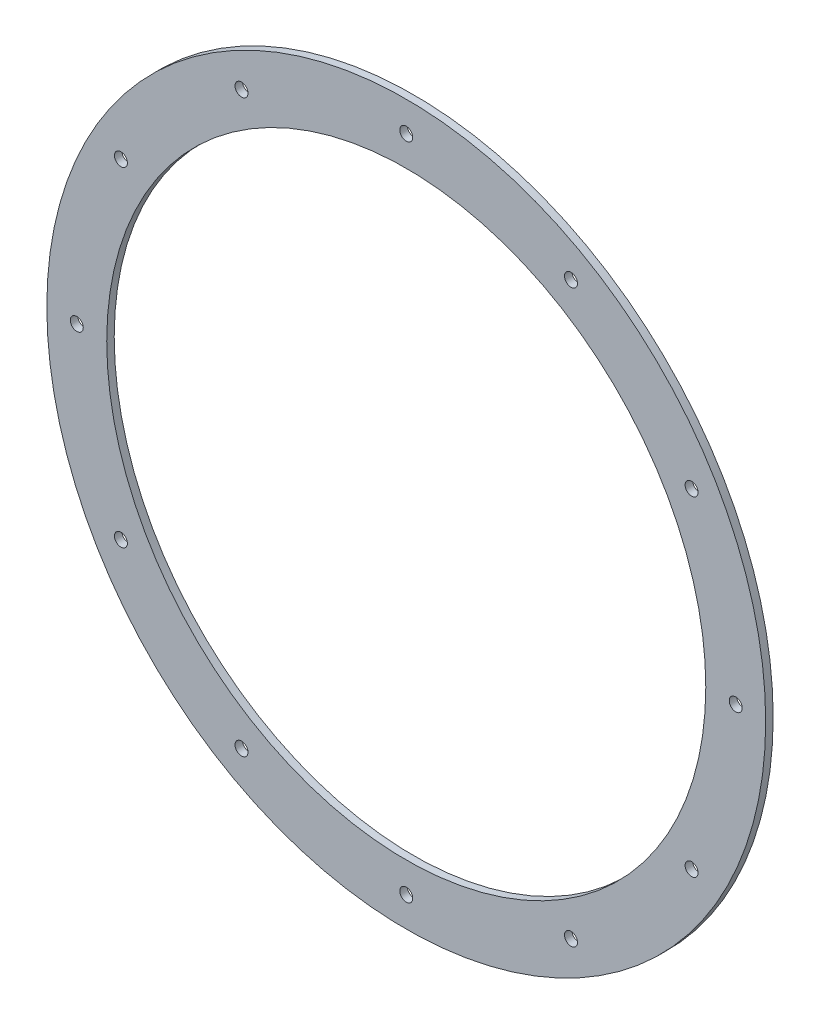
ISO-10303-21;
HEADER;
FILE_DESCRIPTION(('STEP AP214'),'2;1');
FILE_NAME('part.step','',(''),(''),'','','');
FILE_SCHEMA(('AUTOMOTIVE_DESIGN { 1 0 10303 214 1 1 1 1 }'));
ENDSEC;
DATA;
#1=APPLICATION_CONTEXT('core data for automotive mechanical design processes');
#2=APPLICATION_PROTOCOL_DEFINITION('international standard','automotive_design',2000,#1);
#3=PRODUCT_CONTEXT('',#1,'mechanical');
#4=PRODUCT('Part','Part','',(#3));
#5=PRODUCT_RELATED_PRODUCT_CATEGORY('part','',(#4));
#6=PRODUCT_DEFINITION_FORMATION('','',#4);
#7=PRODUCT_DEFINITION_CONTEXT('part definition',#1,'design');
#8=PRODUCT_DEFINITION('design','',#6,#7);
#9=PRODUCT_DEFINITION_SHAPE('','',#8);
#10=(LENGTH_UNIT() NAMED_UNIT(*) SI_UNIT(.MILLI.,.METRE.));
#11=(NAMED_UNIT(*) PLANE_ANGLE_UNIT() SI_UNIT($,.RADIAN.));
#12=(NAMED_UNIT(*) SI_UNIT($,.STERADIAN.) SOLID_ANGLE_UNIT());
#13=UNCERTAINTY_MEASURE_WITH_UNIT(LENGTH_MEASURE(1.E-05),#10,'distance_accuracy_value','');
#14=(GEOMETRIC_REPRESENTATION_CONTEXT(3) GLOBAL_UNCERTAINTY_ASSIGNED_CONTEXT((#13)) GLOBAL_UNIT_ASSIGNED_CONTEXT((#10,
#11,#12)) REPRESENTATION_CONTEXT('',''));
#15=CARTESIAN_POINT('',(0.,0.,0.));
#16=DIRECTION('',(0.,0.,1.));
#17=DIRECTION('',(1.,0.,0.));
#18=AXIS2_PLACEMENT_3D('',#15,#16,#17);
#19=CARTESIAN_POINT('',(0.,0.,12.7));
#20=DIRECTION('',(0.,0.,1.));
#21=DIRECTION('',(1.,0.,0.));
#22=AXIS2_PLACEMENT_3D('',#19,#20,#21);
#23=PLANE('',#22);
#24=CARTESIAN_POINT('',(0.,558.8,12.7));
#25=DIRECTION('',(0.,0.,1.));
#26=DIRECTION('',(1.,0.,0.));
#27=AXIS2_PLACEMENT_3D('',#24,#25,#26);
#28=CIRCLE('',#27,11.);
#29=CARTESIAN_POINT('',(11.,558.8,12.7));
#30=VERTEX_POINT('',#29);
#31=EDGE_CURVE('E49',#30,#30,#28,.T.);
#32=ORIENTED_EDGE('',*,*,#31,.F.);
#33=EDGE_LOOP('',(#32));
#34=FACE_BOUND('',#33,.T.);
#35=CARTESIAN_POINT('',(279.400000000001,483.934995634744,12.7));
#36=DIRECTION('',(0.,0.,1.));
#37=DIRECTION('',(1.,0.,0.));
#38=AXIS2_PLACEMENT_3D('',#35,#36,#37);
#39=CIRCLE('',#38,11.);
#40=CARTESIAN_POINT('',(290.400000000001,483.934995634744,12.7));
#41=VERTEX_POINT('',#40);
#42=EDGE_CURVE('E90',#41,#41,#39,.T.);
#43=ORIENTED_EDGE('',*,*,#42,.F.);
#44=EDGE_LOOP('',(#43));
#45=FACE_BOUND('',#44,.T.);
#46=CARTESIAN_POINT('',(483.934995634756,279.400000000021,12.7));
#47=DIRECTION('',(0.,0.,1.));
#48=DIRECTION('',(1.,0.,0.));
#49=AXIS2_PLACEMENT_3D('',#46,#47,#48);
#50=CIRCLE('',#49,11.0000000000066);
#51=CARTESIAN_POINT('',(494.934995634763,279.400000000021,12.7));
#52=VERTEX_POINT('',#51);
#53=EDGE_CURVE('E84',#52,#52,#50,.T.);
#54=ORIENTED_EDGE('',*,*,#53,.F.);
#55=EDGE_LOOP('',(#54));
#56=FACE_BOUND('',#55,.T.);
#57=CARTESIAN_POINT('',(558.800000000024,2.37546435814283E-11,12.7));
#58=DIRECTION('',(0.,0.,1.));
#59=DIRECTION('',(1.,0.,0.));
#60=AXIS2_PLACEMENT_3D('',#57,#58,#59);
#61=CIRCLE('',#60,11.0000000000176);
#62=CARTESIAN_POINT('',(569.800000000041,2.37546435814283E-11,12.7));
#63=VERTEX_POINT('',#62);
#64=EDGE_CURVE('E78',#63,#63,#61,.T.);
#65=ORIENTED_EDGE('',*,*,#64,.F.);
#66=EDGE_LOOP('',(#65));
#67=FACE_BOUND('',#66,.T.);
#68=CARTESIAN_POINT('',(483.93499563478,-279.399999999979,12.7));
#69=DIRECTION('',(0.,0.,1.));
#70=DIRECTION('',(1.,0.,0.));
#71=AXIS2_PLACEMENT_3D('',#68,#69,#70);
#72=CIRCLE('',#71,11.0000000000306);
#73=CARTESIAN_POINT('',(494.934995634811,-279.399999999979,12.7));
#74=VERTEX_POINT('',#73);
#75=EDGE_CURVE('E72',#74,#74,#72,.T.);
#76=ORIENTED_EDGE('',*,*,#75,.F.);
#77=EDGE_LOOP('',(#76));
#78=FACE_BOUND('',#77,.T.);
#79=CARTESIAN_POINT('',(279.400000000044,-483.934995634732,12.7));
#80=DIRECTION('',(0.,0.,1.));
#81=DIRECTION('',(1.,0.,0.));
#82=AXIS2_PLACEMENT_3D('',#79,#80,#81);
#83=CIRCLE('',#82,11.0000000000423);
#84=CARTESIAN_POINT('',(290.400000000087,-483.934995634732,12.7));
#85=VERTEX_POINT('',#84);
#86=EDGE_CURVE('E66',#85,#85,#83,.T.);
#87=ORIENTED_EDGE('',*,*,#86,.F.);
#88=EDGE_LOOP('',(#87));
#89=FACE_BOUND('',#88,.T.);
#90=CARTESIAN_POINT('',(4.75092871628566E-11,-558.8,12.7));
#91=DIRECTION('',(0.,0.,1.));
#92=DIRECTION('',(1.,0.,0.));
#93=AXIS2_PLACEMENT_3D('',#90,#91,#92);
#94=CIRCLE('',#93,11.0000000000492);
#95=CARTESIAN_POINT('',(11.0000000000967,-558.8,12.7));
#96=VERTEX_POINT('',#95);
#97=EDGE_CURVE('E60',#96,#96,#94,.T.);
#98=ORIENTED_EDGE('',*,*,#97,.F.);
#99=EDGE_LOOP('',(#98));
#100=FACE_BOUND('',#99,.T.);
#101=CARTESIAN_POINT('',(-279.399999999956,-483.934995634756,12.7));
#102=DIRECTION('',(0.,0.,1.));
#103=DIRECTION('',(1.,0.,0.));
#104=AXIS2_PLACEMENT_3D('',#101,#102,#103);
#105=CIRCLE('',#104,11.0000000000504);
#106=CARTESIAN_POINT('',(-268.399999999905,-483.934995634756,12.7));
#107=VERTEX_POINT('',#106);
#108=EDGE_CURVE('E52',#107,#107,#105,.T.);
#109=ORIENTED_EDGE('',*,*,#108,.F.);
#110=EDGE_LOOP('',(#109));
#111=FACE_BOUND('',#110,.T.);
#112=CARTESIAN_POINT('',(-483.934995634709,-279.400000000021,12.7));
#113=DIRECTION('',(0.,0.,1.));
#114=DIRECTION('',(1.,0.,0.));
#115=AXIS2_PLACEMENT_3D('',#112,#113,#114);
#116=CIRCLE('',#115,11.0000000000452);
#117=CARTESIAN_POINT('',(-472.934995634663,-279.400000000021,12.7));
#118=VERTEX_POINT('',#117);
#119=EDGE_CURVE('E59',#118,#118,#116,.T.);
#120=ORIENTED_EDGE('',*,*,#119,.F.);
#121=EDGE_LOOP('',(#120));
#122=FACE_BOUND('',#121,.T.);
#123=CARTESIAN_POINT('',(-558.799999999976,-2.38230768445646E-11,12.7));
#124=DIRECTION('',(0.,0.,1.));
#125=DIRECTION('',(1.,0.,0.));
#126=AXIS2_PLACEMENT_3D('',#123,#124,#125);
#127=CIRCLE('',#126,11.0000000000354);
#128=CARTESIAN_POINT('',(-547.799999999941,-2.38230768445646E-11,12.7));
#129=VERTEX_POINT('',#128);
#130=EDGE_CURVE('E113',#129,#129,#127,.T.);
#131=ORIENTED_EDGE('',*,*,#130,.F.);
#132=EDGE_LOOP('',(#131));
#133=FACE_BOUND('',#132,.T.);
#134=CARTESIAN_POINT('',(-483.934995634733,279.399999999979,12.7));
#135=DIRECTION('',(0.,0.,1.));
#136=DIRECTION('',(1.,0.,0.));
#137=AXIS2_PLACEMENT_3D('',#134,#135,#136);
#138=CIRCLE('',#137,11.000000000024);
#139=CARTESIAN_POINT('',(-472.934995634709,279.399999999979,12.7));
#140=VERTEX_POINT('',#139);
#141=EDGE_CURVE('E107',#140,#140,#138,.T.);
#142=ORIENTED_EDGE('',*,*,#141,.F.);
#143=EDGE_LOOP('',(#142));
#144=FACE_BOUND('',#143,.T.);
#145=CARTESIAN_POINT('',(-279.399999999997,483.934995634732,12.7));
#146=DIRECTION('',(0.,0.,1.));
#147=DIRECTION('',(1.,0.,0.));
#148=AXIS2_PLACEMENT_3D('',#145,#146,#147);
#149=CIRCLE('',#148,11.0000000000136);
#150=CARTESIAN_POINT('',(-268.399999999983,483.934995634732,12.7));
#151=VERTEX_POINT('',#150);
#152=EDGE_CURVE('E100',#151,#151,#149,.T.);
#153=ORIENTED_EDGE('',*,*,#152,.F.);
#154=EDGE_LOOP('',(#153));
#155=FACE_BOUND('',#154,.T.);
#156=CARTESIAN_POINT('',(0.,0.,12.7));
#157=DIRECTION('',(0.,0.,1.));
#158=DIRECTION('',(1.,0.,0.));
#159=AXIS2_PLACEMENT_3D('',#156,#157,#158);
#160=CIRCLE('',#159,609.6);
#161=CARTESIAN_POINT('',(609.6,0.,12.7));
#162=VERTEX_POINT('',#161);
#163=EDGE_CURVE('E10',#162,#162,#160,.T.);
#164=ORIENTED_EDGE('',*,*,#163,.T.);
#165=EDGE_LOOP('',(#164));
#166=FACE_BOUND('',#165,.T.);
#167=CARTESIAN_POINT('',(0.,0.,12.7));
#168=DIRECTION('',(0.,0.,1.));
#169=DIRECTION('',(1.,0.,0.));
#170=AXIS2_PLACEMENT_3D('',#167,#168,#169);
#171=CIRCLE('',#170,508.);
#172=CARTESIAN_POINT('',(508.,0.,12.7));
#173=VERTEX_POINT('',#172);
#174=EDGE_CURVE('E44',#173,#173,#171,.T.);
#175=ORIENTED_EDGE('',*,*,#174,.F.);
#176=EDGE_LOOP('',(#175));
#177=FACE_BOUND('',#176,.T.);
#178=ADVANCED_FACE('F33',(#34,#45,#56,#67,#78,#89,#100,#111,#122,#133,#144,#155,#166,#177),#23,.T.);
#179=CARTESIAN_POINT('',(0.,0.,0.));
#180=DIRECTION('',(0.,0.,1.));
#181=DIRECTION('',(1.,0.,0.));
#182=AXIS2_PLACEMENT_3D('',#179,#180,#181);
#183=PLANE('',#182);
#184=CARTESIAN_POINT('',(0.,558.8,0.));
#185=DIRECTION('',(0.,0.,1.));
#186=DIRECTION('',(1.,0.,0.));
#187=AXIS2_PLACEMENT_3D('',#184,#185,#186);
#188=CIRCLE('',#187,11.);
#189=CARTESIAN_POINT('',(11.,558.8,0.));
#190=VERTEX_POINT('',#189);
#191=EDGE_CURVE('E93',#190,#190,#188,.T.);
#192=ORIENTED_EDGE('',*,*,#191,.T.);
#193=EDGE_LOOP('',(#192));
#194=FACE_BOUND('',#193,.T.);
#195=CARTESIAN_POINT('',(279.400000000001,483.934995634744,0.));
#196=DIRECTION('',(0.,0.,1.));
#197=DIRECTION('',(1.,0.,0.));
#198=AXIS2_PLACEMENT_3D('',#195,#196,#197);
#199=CIRCLE('',#198,11.);
#200=CARTESIAN_POINT('',(290.400000000001,483.934995634744,0.));
#201=VERTEX_POINT('',#200);
#202=EDGE_CURVE('E87',#201,#201,#199,.T.);
#203=ORIENTED_EDGE('',*,*,#202,.T.);
#204=EDGE_LOOP('',(#203));
#205=FACE_BOUND('',#204,.T.);
#206=CARTESIAN_POINT('',(483.934995634756,279.400000000021,0.));
#207=DIRECTION('',(0.,0.,1.));
#208=DIRECTION('',(1.,0.,0.));
#209=AXIS2_PLACEMENT_3D('',#206,#207,#208);
#210=CIRCLE('',#209,11.0000000000066);
#211=CARTESIAN_POINT('',(494.934995634763,279.400000000021,0.));
#212=VERTEX_POINT('',#211);
#213=EDGE_CURVE('E81',#212,#212,#210,.T.);
#214=ORIENTED_EDGE('',*,*,#213,.T.);
#215=EDGE_LOOP('',(#214));
#216=FACE_BOUND('',#215,.T.);
#217=CARTESIAN_POINT('',(558.800000000024,2.37546435814283E-11,0.));
#218=DIRECTION('',(0.,0.,1.));
#219=DIRECTION('',(1.,0.,0.));
#220=AXIS2_PLACEMENT_3D('',#217,#218,#219);
#221=CIRCLE('',#220,11.0000000000176);
#222=CARTESIAN_POINT('',(569.800000000041,2.37546435814283E-11,0.));
#223=VERTEX_POINT('',#222);
#224=EDGE_CURVE('E75',#223,#223,#221,.T.);
#225=ORIENTED_EDGE('',*,*,#224,.T.);
#226=EDGE_LOOP('',(#225));
#227=FACE_BOUND('',#226,.T.);
#228=CARTESIAN_POINT('',(483.93499563478,-279.399999999979,0.));
#229=DIRECTION('',(0.,0.,1.));
#230=DIRECTION('',(1.,0.,0.));
#231=AXIS2_PLACEMENT_3D('',#228,#229,#230);
#232=CIRCLE('',#231,11.0000000000306);
#233=CARTESIAN_POINT('',(494.934995634811,-279.399999999979,0.));
#234=VERTEX_POINT('',#233);
#235=EDGE_CURVE('E69',#234,#234,#232,.T.);
#236=ORIENTED_EDGE('',*,*,#235,.T.);
#237=EDGE_LOOP('',(#236));
#238=FACE_BOUND('',#237,.T.);
#239=CARTESIAN_POINT('',(279.400000000044,-483.934995634732,0.));
#240=DIRECTION('',(0.,0.,1.));
#241=DIRECTION('',(1.,0.,0.));
#242=AXIS2_PLACEMENT_3D('',#239,#240,#241);
#243=CIRCLE('',#242,11.0000000000423);
#244=CARTESIAN_POINT('',(290.400000000087,-483.934995634732,0.));
#245=VERTEX_POINT('',#244);
#246=EDGE_CURVE('E63',#245,#245,#243,.T.);
#247=ORIENTED_EDGE('',*,*,#246,.T.);
#248=EDGE_LOOP('',(#247));
#249=FACE_BOUND('',#248,.T.);
#250=CARTESIAN_POINT('',(4.75092871628566E-11,-558.8,0.));
#251=DIRECTION('',(0.,0.,1.));
#252=DIRECTION('',(1.,0.,0.));
#253=AXIS2_PLACEMENT_3D('',#250,#251,#252);
#254=CIRCLE('',#253,11.0000000000492);
#255=CARTESIAN_POINT('',(11.0000000000967,-558.8,0.));
#256=VERTEX_POINT('',#255);
#257=EDGE_CURVE('E55',#256,#256,#254,.T.);
#258=ORIENTED_EDGE('',*,*,#257,.T.);
#259=EDGE_LOOP('',(#258));
#260=FACE_BOUND('',#259,.T.);
#261=CARTESIAN_POINT('',(-279.399999999956,-483.934995634756,0.));
#262=DIRECTION('',(0.,0.,1.));
#263=DIRECTION('',(1.,0.,0.));
#264=AXIS2_PLACEMENT_3D('',#261,#262,#263);
#265=CIRCLE('',#264,11.0000000000504);
#266=CARTESIAN_POINT('',(-268.399999999905,-483.934995634756,0.));
#267=VERTEX_POINT('',#266);
#268=EDGE_CURVE('E56',#267,#267,#265,.T.);
#269=ORIENTED_EDGE('',*,*,#268,.T.);
#270=EDGE_LOOP('',(#269));
#271=FACE_BOUND('',#270,.T.);
#272=CARTESIAN_POINT('',(-483.934995634709,-279.400000000021,0.));
#273=DIRECTION('',(0.,0.,1.));
#274=DIRECTION('',(1.,0.,0.));
#275=AXIS2_PLACEMENT_3D('',#272,#273,#274);
#276=CIRCLE('',#275,11.0000000000452);
#277=CARTESIAN_POINT('',(-472.934995634663,-279.400000000021,0.));
#278=VERTEX_POINT('',#277);
#279=EDGE_CURVE('E116',#278,#278,#276,.T.);
#280=ORIENTED_EDGE('',*,*,#279,.T.);
#281=EDGE_LOOP('',(#280));
#282=FACE_BOUND('',#281,.T.);
#283=CARTESIAN_POINT('',(-558.799999999976,-2.38230768445646E-11,0.));
#284=DIRECTION('',(0.,0.,1.));
#285=DIRECTION('',(1.,0.,0.));
#286=AXIS2_PLACEMENT_3D('',#283,#284,#285);
#287=CIRCLE('',#286,11.0000000000354);
#288=CARTESIAN_POINT('',(-547.799999999941,-2.38230768445646E-11,0.));
#289=VERTEX_POINT('',#288);
#290=EDGE_CURVE('E110',#289,#289,#287,.T.);
#291=ORIENTED_EDGE('',*,*,#290,.T.);
#292=EDGE_LOOP('',(#291));
#293=FACE_BOUND('',#292,.T.);
#294=CARTESIAN_POINT('',(-483.934995634733,279.399999999979,0.));
#295=DIRECTION('',(0.,0.,1.));
#296=DIRECTION('',(1.,0.,0.));
#297=AXIS2_PLACEMENT_3D('',#294,#295,#296);
#298=CIRCLE('',#297,11.000000000024);
#299=CARTESIAN_POINT('',(-472.934995634709,279.399999999979,0.));
#300=VERTEX_POINT('',#299);
#301=EDGE_CURVE('E103',#300,#300,#298,.T.);
#302=ORIENTED_EDGE('',*,*,#301,.T.);
#303=EDGE_LOOP('',(#302));
#304=FACE_BOUND('',#303,.T.);
#305=CARTESIAN_POINT('',(-279.399999999997,483.934995634732,0.));
#306=DIRECTION('',(0.,0.,1.));
#307=DIRECTION('',(1.,0.,0.));
#308=AXIS2_PLACEMENT_3D('',#305,#306,#307);
#309=CIRCLE('',#308,11.0000000000136);
#310=CARTESIAN_POINT('',(-268.399999999983,483.934995634732,0.));
#311=VERTEX_POINT('',#310);
#312=EDGE_CURVE('E104',#311,#311,#309,.T.);
#313=ORIENTED_EDGE('',*,*,#312,.T.);
#314=EDGE_LOOP('',(#313));
#315=FACE_BOUND('',#314,.T.);
#316=CARTESIAN_POINT('',(0.,0.,0.));
#317=DIRECTION('',(0.,0.,1.));
#318=DIRECTION('',(1.,0.,0.));
#319=AXIS2_PLACEMENT_3D('',#316,#317,#318);
#320=CIRCLE('',#319,609.6);
#321=CARTESIAN_POINT('',(609.6,0.,0.));
#322=VERTEX_POINT('',#321);
#323=EDGE_CURVE('E37',#322,#322,#320,.T.);
#324=ORIENTED_EDGE('',*,*,#323,.F.);
#325=EDGE_LOOP('',(#324));
#326=FACE_BOUND('',#325,.T.);
#327=CARTESIAN_POINT('',(0.,0.,0.));
#328=DIRECTION('',(0.,0.,1.));
#329=DIRECTION('',(1.,0.,0.));
#330=AXIS2_PLACEMENT_3D('',#327,#328,#329);
#331=CIRCLE('',#330,508.);
#332=CARTESIAN_POINT('',(508.,0.,0.));
#333=VERTEX_POINT('',#332);
#334=EDGE_CURVE('E46',#333,#333,#331,.T.);
#335=ORIENTED_EDGE('',*,*,#334,.T.);
#336=EDGE_LOOP('',(#335));
#337=FACE_BOUND('',#336,.T.);
#338=ADVANCED_FACE('F124',(#194,#205,#216,#227,#238,#249,#260,#271,#282,#293,#304,#315,#326,
#337),#183,.F.);
#339=CARTESIAN_POINT('',(0.,0.,12.7));
#340=DIRECTION('',(0.,0.,-1.));
#341=DIRECTION('',(-1.,0.,0.));
#342=AXIS2_PLACEMENT_3D('',#339,#340,#341);
#343=CYLINDRICAL_SURFACE('',#342,609.6);
#344=ORIENTED_EDGE('',*,*,#163,.F.);
#345=EDGE_LOOP('',(#344));
#346=FACE_BOUND('',#345,.T.);
#347=ORIENTED_EDGE('',*,*,#323,.T.);
#348=EDGE_LOOP('',(#347));
#349=FACE_BOUND('',#348,.T.);
#350=ADVANCED_FACE('F35',(#346,#349),#343,.T.);
#351=CARTESIAN_POINT('',(0.,0.,12.7));
#352=DIRECTION('',(0.,0.,-1.));
#353=DIRECTION('',(-1.,0.,0.));
#354=AXIS2_PLACEMENT_3D('',#351,#352,#353);
#355=CYLINDRICAL_SURFACE('',#354,508.);
#356=ORIENTED_EDGE('',*,*,#174,.T.);
#357=EDGE_LOOP('',(#356));
#358=FACE_BOUND('',#357,.T.);
#359=ORIENTED_EDGE('',*,*,#334,.F.);
#360=EDGE_LOOP('',(#359));
#361=FACE_BOUND('',#360,.T.);
#362=ADVANCED_FACE('F147',(#358,#361),#355,.F.);
#363=CARTESIAN_POINT('',(-279.399999999997,483.934995634732,43.8126983723505));
#364=DIRECTION('',(0.,0.,-1.));
#365=DIRECTION('',(-1.,0.,0.));
#366=AXIS2_PLACEMENT_3D('',#363,#364,#365);
#367=CYLINDRICAL_SURFACE('',#366,11.0000000000136);
#368=ORIENTED_EDGE('',*,*,#312,.F.);
#369=EDGE_LOOP('',(#368));
#370=FACE_BOUND('',#369,.T.);
#371=ORIENTED_EDGE('',*,*,#152,.T.);
#372=EDGE_LOOP('',(#371));
#373=FACE_BOUND('',#372,.T.);
#374=ADVANCED_FACE('F150',(#370,#373),#367,.F.);
#375=CARTESIAN_POINT('',(-483.934995634733,279.399999999979,43.8126983723505));
#376=DIRECTION('',(0.,0.,-1.));
#377=DIRECTION('',(-1.,0.,0.));
#378=AXIS2_PLACEMENT_3D('',#375,#376,#377);
#379=CYLINDRICAL_SURFACE('',#378,11.000000000024);
#380=ORIENTED_EDGE('',*,*,#301,.F.);
#381=EDGE_LOOP('',(#380));
#382=FACE_BOUND('',#381,.T.);
#383=ORIENTED_EDGE('',*,*,#141,.T.);
#384=EDGE_LOOP('',(#383));
#385=FACE_BOUND('',#384,.T.);
#386=ADVANCED_FACE('F195',(#382,#385),#379,.F.);
#387=CARTESIAN_POINT('',(-558.799999999976,-2.38230768445646E-11,43.8126983723505));
#388=DIRECTION('',(0.,0.,-1.));
#389=DIRECTION('',(-1.,0.,0.));
#390=AXIS2_PLACEMENT_3D('',#387,#388,#389);
#391=CYLINDRICAL_SURFACE('',#390,11.0000000000354);
#392=ORIENTED_EDGE('',*,*,#290,.F.);
#393=EDGE_LOOP('',(#392));
#394=FACE_BOUND('',#393,.T.);
#395=ORIENTED_EDGE('',*,*,#130,.T.);
#396=EDGE_LOOP('',(#395));
#397=FACE_BOUND('',#396,.T.);
#398=ADVANCED_FACE('F131',(#394,#397),#391,.F.);
#399=CARTESIAN_POINT('',(-483.934995634709,-279.400000000021,43.8126983723505));
#400=DIRECTION('',(0.,0.,-1.));
#401=DIRECTION('',(-1.,0.,0.));
#402=AXIS2_PLACEMENT_3D('',#399,#400,#401);
#403=CYLINDRICAL_SURFACE('',#402,11.0000000000452);
#404=ORIENTED_EDGE('',*,*,#279,.F.);
#405=EDGE_LOOP('',(#404));
#406=FACE_BOUND('',#405,.T.);
#407=ORIENTED_EDGE('',*,*,#119,.T.);
#408=EDGE_LOOP('',(#407));
#409=FACE_BOUND('',#408,.T.);
#410=ADVANCED_FACE('F127',(#406,#409),#403,.F.);
#411=CARTESIAN_POINT('',(-279.399999999956,-483.934995634756,43.8126983723505));
#412=DIRECTION('',(0.,0.,-1.));
#413=DIRECTION('',(-1.,0.,0.));
#414=AXIS2_PLACEMENT_3D('',#411,#412,#413);
#415=CYLINDRICAL_SURFACE('',#414,11.0000000000504);
#416=ORIENTED_EDGE('',*,*,#268,.F.);
#417=EDGE_LOOP('',(#416));
#418=FACE_BOUND('',#417,.T.);
#419=ORIENTED_EDGE('',*,*,#108,.T.);
#420=EDGE_LOOP('',(#419));
#421=FACE_BOUND('',#420,.T.);
#422=ADVANCED_FACE('F130',(#418,#421),#415,.F.);
#423=CARTESIAN_POINT('',(4.75092871628566E-11,-558.8,43.8126983723505));
#424=DIRECTION('',(0.,0.,-1.));
#425=DIRECTION('',(-1.,0.,0.));
#426=AXIS2_PLACEMENT_3D('',#423,#424,#425);
#427=CYLINDRICAL_SURFACE('',#426,11.0000000000492);
#428=ORIENTED_EDGE('',*,*,#257,.F.);
#429=EDGE_LOOP('',(#428));
#430=FACE_BOUND('',#429,.T.);
#431=ORIENTED_EDGE('',*,*,#97,.T.);
#432=EDGE_LOOP('',(#431));
#433=FACE_BOUND('',#432,.T.);
#434=ADVANCED_FACE('F164',(#430,#433),#427,.F.);
#435=CARTESIAN_POINT('',(279.400000000044,-483.934995634732,43.8126983723505));
#436=DIRECTION('',(0.,0.,-1.));
#437=DIRECTION('',(-1.,0.,0.));
#438=AXIS2_PLACEMENT_3D('',#435,#436,#437);
#439=CYLINDRICAL_SURFACE('',#438,11.0000000000423);
#440=ORIENTED_EDGE('',*,*,#246,.F.);
#441=EDGE_LOOP('',(#440));
#442=FACE_BOUND('',#441,.T.);
#443=ORIENTED_EDGE('',*,*,#86,.T.);
#444=EDGE_LOOP('',(#443));
#445=FACE_BOUND('',#444,.T.);
#446=ADVANCED_FACE('F168',(#442,#445),#439,.F.);
#447=CARTESIAN_POINT('',(483.93499563478,-279.399999999979,43.8126983723505));
#448=DIRECTION('',(0.,0.,-1.));
#449=DIRECTION('',(-1.,0.,0.));
#450=AXIS2_PLACEMENT_3D('',#447,#448,#449);
#451=CYLINDRICAL_SURFACE('',#450,11.0000000000306);
#452=ORIENTED_EDGE('',*,*,#235,.F.);
#453=EDGE_LOOP('',(#452));
#454=FACE_BOUND('',#453,.T.);
#455=ORIENTED_EDGE('',*,*,#75,.T.);
#456=EDGE_LOOP('',(#455));
#457=FACE_BOUND('',#456,.T.);
#458=ADVANCED_FACE('F172',(#454,#457),#451,.F.);
#459=CARTESIAN_POINT('',(558.800000000024,2.37546435814283E-11,43.8126983723505));
#460=DIRECTION('',(0.,0.,-1.));
#461=DIRECTION('',(-1.,0.,0.));
#462=AXIS2_PLACEMENT_3D('',#459,#460,#461);
#463=CYLINDRICAL_SURFACE('',#462,11.0000000000176);
#464=ORIENTED_EDGE('',*,*,#224,.F.);
#465=EDGE_LOOP('',(#464));
#466=FACE_BOUND('',#465,.T.);
#467=ORIENTED_EDGE('',*,*,#64,.T.);
#468=EDGE_LOOP('',(#467));
#469=FACE_BOUND('',#468,.T.);
#470=ADVANCED_FACE('F176',(#466,#469),#463,.F.);
#471=CARTESIAN_POINT('',(483.934995634756,279.400000000021,43.8126983723505));
#472=DIRECTION('',(0.,0.,-1.));
#473=DIRECTION('',(-1.,0.,0.));
#474=AXIS2_PLACEMENT_3D('',#471,#472,#473);
#475=CYLINDRICAL_SURFACE('',#474,11.0000000000066);
#476=ORIENTED_EDGE('',*,*,#213,.F.);
#477=EDGE_LOOP('',(#476));
#478=FACE_BOUND('',#477,.T.);
#479=ORIENTED_EDGE('',*,*,#53,.T.);
#480=EDGE_LOOP('',(#479));
#481=FACE_BOUND('',#480,.T.);
#482=ADVANCED_FACE('F180',(#478,#481),#475,.F.);
#483=CARTESIAN_POINT('',(279.400000000001,483.934995634744,43.8126983723505));
#484=DIRECTION('',(0.,0.,-1.));
#485=DIRECTION('',(-1.,0.,0.));
#486=AXIS2_PLACEMENT_3D('',#483,#484,#485);
#487=CYLINDRICAL_SURFACE('',#486,11.);
#488=ORIENTED_EDGE('',*,*,#202,.F.);
#489=EDGE_LOOP('',(#488));
#490=FACE_BOUND('',#489,.T.);
#491=ORIENTED_EDGE('',*,*,#42,.T.);
#492=EDGE_LOOP('',(#491));
#493=FACE_BOUND('',#492,.T.);
#494=ADVANCED_FACE('F184',(#490,#493),#487,.F.);
#495=CARTESIAN_POINT('',(0.,558.8,43.8126983723505));
#496=DIRECTION('',(0.,0.,-1.));
#497=DIRECTION('',(-1.,0.,0.));
#498=AXIS2_PLACEMENT_3D('',#495,#496,#497);
#499=CYLINDRICAL_SURFACE('',#498,11.);
#500=ORIENTED_EDGE('',*,*,#191,.F.);
#501=EDGE_LOOP('',(#500));
#502=FACE_BOUND('',#501,.T.);
#503=ORIENTED_EDGE('',*,*,#31,.T.);
#504=EDGE_LOOP('',(#503));
#505=FACE_BOUND('',#504,.T.);
#506=ADVANCED_FACE('F188',(#502,#505),#499,.F.);
#507=CLOSED_SHELL('',(#178,#338,#350,#362,#374,#386,#398,#410,#422,#434,#446,#458,#470,#482,
#494,#506));
#508=MANIFOLD_SOLID_BREP('B2',#507);
#509=ADVANCED_BREP_SHAPE_REPRESENTATION('',(#18,#508),#14);
#510=SHAPE_DEFINITION_REPRESENTATION(#9,#509);
ENDSEC;
END-ISO-10303-21;
